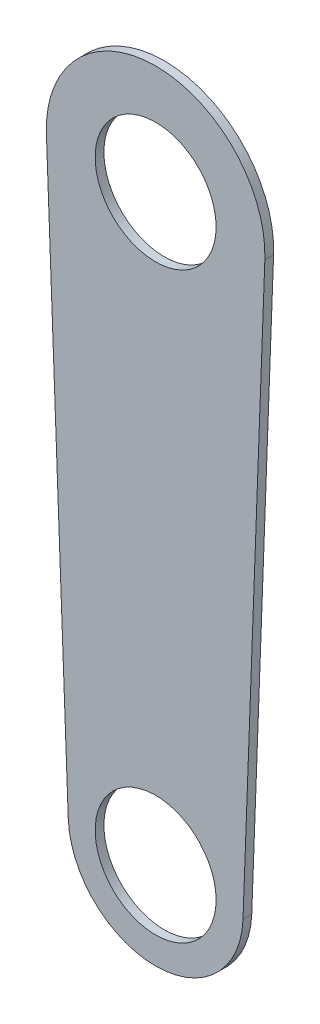
ISO-10303-21;
HEADER;
FILE_DESCRIPTION(('STEP AP214'),'2;1');
FILE_NAME('part.step','',(''),(''),'','','');
FILE_SCHEMA(('AUTOMOTIVE_DESIGN { 1 0 10303 214 1 1 1 1 }'));
ENDSEC;
DATA;
#1=APPLICATION_CONTEXT('core data for automotive mechanical design processes');
#2=APPLICATION_PROTOCOL_DEFINITION('international standard','automotive_design',2000,#1);
#3=PRODUCT_CONTEXT('',#1,'mechanical');
#4=PRODUCT('Part','Part','',(#3));
#5=PRODUCT_RELATED_PRODUCT_CATEGORY('part','',(#4));
#6=PRODUCT_DEFINITION_FORMATION('','',#4);
#7=PRODUCT_DEFINITION_CONTEXT('part definition',#1,'design');
#8=PRODUCT_DEFINITION('design','',#6,#7);
#9=PRODUCT_DEFINITION_SHAPE('','',#8);
#10=(LENGTH_UNIT() NAMED_UNIT(*) SI_UNIT(.MILLI.,.METRE.));
#11=(NAMED_UNIT(*) PLANE_ANGLE_UNIT() SI_UNIT($,.RADIAN.));
#12=(NAMED_UNIT(*) SI_UNIT($,.STERADIAN.) SOLID_ANGLE_UNIT());
#13=UNCERTAINTY_MEASURE_WITH_UNIT(LENGTH_MEASURE(1.E-05),#10,'distance_accuracy_value','');
#14=(GEOMETRIC_REPRESENTATION_CONTEXT(3) GLOBAL_UNCERTAINTY_ASSIGNED_CONTEXT((#13)) GLOBAL_UNIT_ASSIGNED_CONTEXT((#10,
#11,#12)) REPRESENTATION_CONTEXT('',''));
#15=CARTESIAN_POINT('',(0.,0.,0.));
#16=DIRECTION('',(0.,0.,1.));
#17=DIRECTION('',(1.,0.,0.));
#18=AXIS2_PLACEMENT_3D('',#15,#16,#17);
#19=CARTESIAN_POINT('',(0.,0.,6.));
#20=DIRECTION('',(0.,0.,1.));
#21=DIRECTION('',(1.,0.,0.));
#22=AXIS2_PLACEMENT_3D('',#19,#20,#21);
#23=PLANE('',#22);
#24=CARTESIAN_POINT('',(1.02355033522682E-13,-400.,6.));
#25=DIRECTION('',(0.,0.,1.));
#26=DIRECTION('',(1.,0.,0.));
#27=AXIS2_PLACEMENT_3D('',#24,#25,#26);
#28=CIRCLE('',#27,41.5);
#29=CARTESIAN_POINT('',(41.5000000000001,-400.,6.));
#30=VERTEX_POINT('',#29);
#31=EDGE_CURVE('E131',#30,#30,#28,.T.);
#32=ORIENTED_EDGE('',*,*,#31,.F.);
#33=EDGE_LOOP('',(#32));
#34=FACE_BOUND('',#33,.T.);
#35=CARTESIAN_POINT('',(0.,0.,6.));
#36=DIRECTION('',(0.,0.,1.));
#37=DIRECTION('',(1.,0.,0.));
#38=AXIS2_PLACEMENT_3D('',#35,#36,#37);
#39=CIRCLE('',#38,75.);
#40=CARTESIAN_POINT('',(74.9472470725243,-2.81249999999998,6.));
#41=VERTEX_POINT('',#40);
#42=CARTESIAN_POINT('',(-74.9472470725242,-2.81250000000002,6.));
#43=VERTEX_POINT('',#42);
#44=EDGE_CURVE('E115',#41,#43,#39,.T.);
#45=ORIENTED_EDGE('',*,*,#44,.T.);
#46=DIRECTION('',(0.0375000000000002,-0.999296627633657,0.));
#47=VECTOR('',#46,1.);
#48=CARTESIAN_POINT('',(-74.9472470725242,-2.81250000000002,6.));
#49=LINE('',#48,#47);
#50=CARTESIAN_POINT('',(-59.9577976580193,-402.25,6.));
#51=VERTEX_POINT('',#50);
#52=EDGE_CURVE('E108',#43,#51,#49,.T.);
#53=ORIENTED_EDGE('',*,*,#52,.T.);
#54=CARTESIAN_POINT('',(1.02355033522682E-13,-400.,6.));
#55=DIRECTION('',(0.,0.,1.));
#56=DIRECTION('',(1.,0.,0.));
#57=AXIS2_PLACEMENT_3D('',#54,#55,#56);
#58=CIRCLE('',#57,60.);
#59=CARTESIAN_POINT('',(59.9577976580196,-402.25,6.));
#60=VERTEX_POINT('',#59);
#61=EDGE_CURVE('E114',#51,#60,#58,.T.);
#62=ORIENTED_EDGE('',*,*,#61,.T.);
#63=DIRECTION('',(-0.0374999999999997,-0.999296627633657,0.));
#64=VECTOR('',#63,1.);
#65=CARTESIAN_POINT('',(74.9472470725243,-2.81249999999998,6.));
#66=LINE('',#65,#64);
#67=EDGE_CURVE('E124',#41,#60,#66,.T.);
#68=ORIENTED_EDGE('',*,*,#67,.F.);
#69=EDGE_LOOP('',(#45,#53,#62,#68));
#70=FACE_BOUND('',#69,.T.);
#71=CARTESIAN_POINT('',(0.,0.,6.));
#72=DIRECTION('',(0.,0.,1.));
#73=DIRECTION('',(1.,0.,0.));
#74=AXIS2_PLACEMENT_3D('',#71,#72,#73);
#75=CIRCLE('',#74,41.5);
#76=CARTESIAN_POINT('',(41.5,0.,6.));
#77=VERTEX_POINT('',#76);
#78=EDGE_CURVE('E144',#77,#77,#75,.T.);
#79=ORIENTED_EDGE('',*,*,#78,.F.);
#80=EDGE_LOOP('',(#79));
#81=FACE_BOUND('',#80,.T.);
#82=ADVANCED_FACE('F65',(#34,#70,#81),#23,.T.);
#83=CARTESIAN_POINT('',(0.,0.,0.));
#84=DIRECTION('',(0.,0.,1.));
#85=DIRECTION('',(1.,0.,0.));
#86=AXIS2_PLACEMENT_3D('',#83,#84,#85);
#87=PLANE('',#86);
#88=CARTESIAN_POINT('',(0.,0.,0.));
#89=DIRECTION('',(0.,0.,1.));
#90=DIRECTION('',(1.,0.,0.));
#91=AXIS2_PLACEMENT_3D('',#88,#89,#90);
#92=CIRCLE('',#91,75.);
#93=CARTESIAN_POINT('',(74.9472470725243,-2.81249999999998,0.));
#94=VERTEX_POINT('',#93);
#95=CARTESIAN_POINT('',(-74.9472470725242,-2.81250000000002,0.));
#96=VERTEX_POINT('',#95);
#97=EDGE_CURVE('E129',#94,#96,#92,.T.);
#98=ORIENTED_EDGE('',*,*,#97,.F.);
#99=DIRECTION('',(-0.0374999999999997,-0.999296627633657,0.));
#100=VECTOR('',#99,1.);
#101=CARTESIAN_POINT('',(74.9472470725243,-2.81249999999998,0.));
#102=LINE('',#101,#100);
#103=CARTESIAN_POINT('',(59.9577976580196,-402.25,0.));
#104=VERTEX_POINT('',#103);
#105=EDGE_CURVE('E135',#94,#104,#102,.T.);
#106=ORIENTED_EDGE('',*,*,#105,.T.);
#107=CARTESIAN_POINT('',(1.02355033522682E-13,-400.,0.));
#108=DIRECTION('',(0.,0.,1.));
#109=DIRECTION('',(1.,0.,0.));
#110=AXIS2_PLACEMENT_3D('',#107,#108,#109);
#111=CIRCLE('',#110,60.);
#112=CARTESIAN_POINT('',(-59.9577976580193,-402.25,0.));
#113=VERTEX_POINT('',#112);
#114=EDGE_CURVE('E133',#113,#104,#111,.T.);
#115=ORIENTED_EDGE('',*,*,#114,.F.);
#116=DIRECTION('',(0.0375000000000002,-0.999296627633657,0.));
#117=VECTOR('',#116,1.);
#118=CARTESIAN_POINT('',(-74.9472470725242,-2.81250000000002,0.));
#119=LINE('',#118,#117);
#120=EDGE_CURVE('E120',#96,#113,#119,.T.);
#121=ORIENTED_EDGE('',*,*,#120,.F.);
#122=EDGE_LOOP('',(#98,#106,#115,#121));
#123=FACE_BOUND('',#122,.T.);
#124=CARTESIAN_POINT('',(1.02355033522682E-13,-400.,0.));
#125=DIRECTION('',(0.,0.,1.));
#126=DIRECTION('',(1.,0.,0.));
#127=AXIS2_PLACEMENT_3D('',#124,#125,#126);
#128=CIRCLE('',#127,41.5);
#129=CARTESIAN_POINT('',(41.5000000000001,-400.,0.));
#130=VERTEX_POINT('',#129);
#131=EDGE_CURVE('E141',#130,#130,#128,.T.);
#132=ORIENTED_EDGE('',*,*,#131,.T.);
#133=EDGE_LOOP('',(#132));
#134=FACE_BOUND('',#133,.T.);
#135=CARTESIAN_POINT('',(0.,0.,0.));
#136=DIRECTION('',(0.,0.,1.));
#137=DIRECTION('',(1.,0.,0.));
#138=AXIS2_PLACEMENT_3D('',#135,#136,#137);
#139=CIRCLE('',#138,41.5);
#140=CARTESIAN_POINT('',(41.5,0.,0.));
#141=VERTEX_POINT('',#140);
#142=EDGE_CURVE('E147',#141,#141,#139,.T.);
#143=ORIENTED_EDGE('',*,*,#142,.T.);
#144=EDGE_LOOP('',(#143));
#145=FACE_BOUND('',#144,.T.);
#146=ADVANCED_FACE('F156',(#123,#134,#145),#87,.F.);
#147=CARTESIAN_POINT('',(0.,0.,6.));
#148=DIRECTION('',(0.,0.,-1.));
#149=DIRECTION('',(-1.,0.,0.));
#150=AXIS2_PLACEMENT_3D('',#147,#148,#149);
#151=CYLINDRICAL_SURFACE('',#150,75.);
#152=ORIENTED_EDGE('',*,*,#97,.T.);
#153=DIRECTION('',(0.,0.,-1.));
#154=VECTOR('',#153,1.);
#155=CARTESIAN_POINT('',(-74.9472470725242,-2.81250000000002,6.));
#156=LINE('',#155,#154);
#157=EDGE_CURVE('E12',#43,#96,#156,.T.);
#158=ORIENTED_EDGE('',*,*,#157,.F.);
#159=ORIENTED_EDGE('',*,*,#44,.F.);
#160=DIRECTION('',(0.,0.,-1.));
#161=VECTOR('',#160,1.);
#162=CARTESIAN_POINT('',(74.9472470725243,-2.81249999999998,6.));
#163=LINE('',#162,#161);
#164=EDGE_CURVE('E82',#41,#94,#163,.T.);
#165=ORIENTED_EDGE('',*,*,#164,.T.);
#166=EDGE_LOOP('',(#152,#158,#159,#165));
#167=FACE_BOUND('',#166,.T.);
#168=ADVANCED_FACE('F67',(#167),#151,.T.);
#169=CARTESIAN_POINT('',(-74.9472470725242,-2.81250000000002,6.));
#170=DIRECTION('',(0.999296627633657,0.0375000000000002,0.));
#171=DIRECTION('',(-0.0375000000000002,0.999296627633657,0.));
#172=AXIS2_PLACEMENT_3D('',#169,#170,#171);
#173=PLANE('',#172);
#174=ORIENTED_EDGE('',*,*,#120,.T.);
#175=DIRECTION('',(0.,0.,-1.));
#176=VECTOR('',#175,1.);
#177=CARTESIAN_POINT('',(-59.9577976580193,-402.25,6.));
#178=LINE('',#177,#176);
#179=EDGE_CURVE('E74',#51,#113,#178,.T.);
#180=ORIENTED_EDGE('',*,*,#179,.F.);
#181=ORIENTED_EDGE('',*,*,#52,.F.);
#182=ORIENTED_EDGE('',*,*,#157,.T.);
#183=EDGE_LOOP('',(#174,#180,#181,#182));
#184=FACE_BOUND('',#183,.T.);
#185=ADVANCED_FACE('F119',(#184),#173,.F.);
#186=CARTESIAN_POINT('',(1.02355033522682E-13,-400.,6.));
#187=DIRECTION('',(0.,0.,-1.));
#188=DIRECTION('',(-1.,0.,0.));
#189=AXIS2_PLACEMENT_3D('',#186,#187,#188);
#190=CYLINDRICAL_SURFACE('',#189,60.);
#191=ORIENTED_EDGE('',*,*,#114,.T.);
#192=DIRECTION('',(0.,0.,-1.));
#193=VECTOR('',#192,1.);
#194=CARTESIAN_POINT('',(59.9577976580196,-402.25,6.));
#195=LINE('',#194,#193);
#196=EDGE_CURVE('E97',#60,#104,#195,.T.);
#197=ORIENTED_EDGE('',*,*,#196,.F.);
#198=ORIENTED_EDGE('',*,*,#61,.F.);
#199=ORIENTED_EDGE('',*,*,#179,.T.);
#200=EDGE_LOOP('',(#191,#197,#198,#199));
#201=FACE_BOUND('',#200,.T.);
#202=ADVANCED_FACE('F123',(#201),#190,.T.);
#203=CARTESIAN_POINT('',(74.9472470725243,-2.81249999999998,6.));
#204=DIRECTION('',(0.999296627633657,-0.0374999999999997,0.));
#205=DIRECTION('',(0.0374999999999997,0.999296627633657,0.));
#206=AXIS2_PLACEMENT_3D('',#203,#204,#205);
#207=PLANE('',#206);
#208=ORIENTED_EDGE('',*,*,#105,.F.);
#209=ORIENTED_EDGE('',*,*,#164,.F.);
#210=ORIENTED_EDGE('',*,*,#67,.T.);
#211=ORIENTED_EDGE('',*,*,#196,.T.);
#212=EDGE_LOOP('',(#208,#209,#210,#211));
#213=FACE_BOUND('',#212,.T.);
#214=ADVANCED_FACE('F168',(#213),#207,.T.);
#215=CARTESIAN_POINT('',(1.02355033522682E-13,-400.,6.));
#216=DIRECTION('',(0.,0.,-1.));
#217=DIRECTION('',(-1.,0.,0.));
#218=AXIS2_PLACEMENT_3D('',#215,#216,#217);
#219=CYLINDRICAL_SURFACE('',#218,41.5);
#220=ORIENTED_EDGE('',*,*,#31,.T.);
#221=EDGE_LOOP('',(#220));
#222=FACE_BOUND('',#221,.T.);
#223=ORIENTED_EDGE('',*,*,#131,.F.);
#224=EDGE_LOOP('',(#223));
#225=FACE_BOUND('',#224,.T.);
#226=ADVANCED_FACE('F165',(#222,#225),#219,.F.);
#227=CARTESIAN_POINT('',(0.,0.,6.));
#228=DIRECTION('',(0.,0.,-1.));
#229=DIRECTION('',(-1.,0.,0.));
#230=AXIS2_PLACEMENT_3D('',#227,#228,#229);
#231=CYLINDRICAL_SURFACE('',#230,41.5);
#232=ORIENTED_EDGE('',*,*,#78,.T.);
#233=EDGE_LOOP('',(#232));
#234=FACE_BOUND('',#233,.T.);
#235=ORIENTED_EDGE('',*,*,#142,.F.);
#236=EDGE_LOOP('',(#235));
#237=FACE_BOUND('',#236,.T.);
#238=ADVANCED_FACE('F153',(#234,#237),#231,.F.);
#239=CLOSED_SHELL('',(#82,#146,#168,#185,#202,#214,#226,#238));
#240=MANIFOLD_SOLID_BREP('B2',#239);
#241=ADVANCED_BREP_SHAPE_REPRESENTATION('',(#18,#240),#14);
#242=SHAPE_DEFINITION_REPRESENTATION(#9,#241);
ENDSEC;
END-ISO-10303-21;
